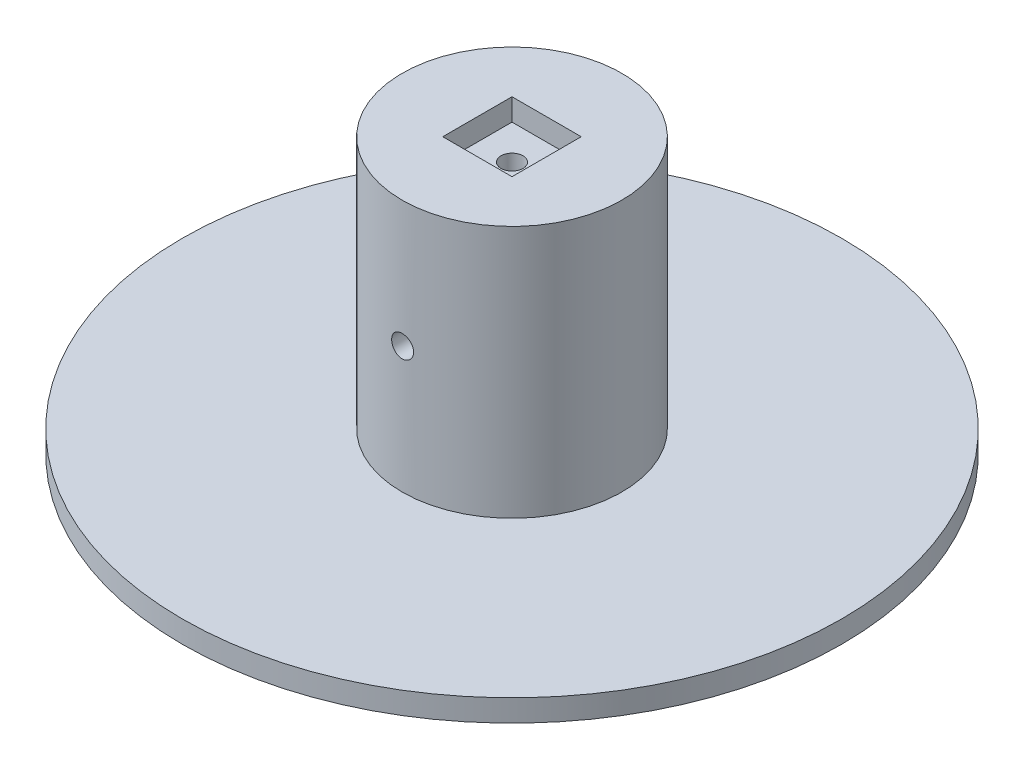
ISO-10303-21;
HEADER;
FILE_DESCRIPTION(('STEP AP214'),'2;1');
FILE_NAME('part.step','',(''),(''),'','','');
FILE_SCHEMA(('AUTOMOTIVE_DESIGN { 1 0 10303 214 1 1 1 1 }'));
ENDSEC;
DATA;
#1=APPLICATION_CONTEXT('core data for automotive mechanical design processes');
#2=APPLICATION_PROTOCOL_DEFINITION('international standard','automotive_design',2000,#1);
#3=PRODUCT_CONTEXT('',#1,'mechanical');
#4=PRODUCT('Part','Part','',(#3));
#5=PRODUCT_RELATED_PRODUCT_CATEGORY('part','',(#4));
#6=PRODUCT_DEFINITION_FORMATION('','',#4);
#7=PRODUCT_DEFINITION_CONTEXT('part definition',#1,'design');
#8=PRODUCT_DEFINITION('design','',#6,#7);
#9=PRODUCT_DEFINITION_SHAPE('','',#8);
#10=(LENGTH_UNIT() NAMED_UNIT(*) SI_UNIT(.MILLI.,.METRE.));
#11=(NAMED_UNIT(*) PLANE_ANGLE_UNIT() SI_UNIT($,.RADIAN.));
#12=(NAMED_UNIT(*) SI_UNIT($,.STERADIAN.) SOLID_ANGLE_UNIT());
#13=UNCERTAINTY_MEASURE_WITH_UNIT(LENGTH_MEASURE(1.E-05),#10,'distance_accuracy_value','');
#14=(GEOMETRIC_REPRESENTATION_CONTEXT(3) GLOBAL_UNCERTAINTY_ASSIGNED_CONTEXT((#13)) GLOBAL_UNIT_ASSIGNED_CONTEXT((#10,
#11,#12)) REPRESENTATION_CONTEXT('',''));
#15=CARTESIAN_POINT('',(0.,0.,0.));
#16=DIRECTION('',(0.,0.,1.));
#17=DIRECTION('',(1.,0.,0.));
#18=AXIS2_PLACEMENT_3D('',#15,#16,#17);
#19=CARTESIAN_POINT('',(0.,2.,0.));
#20=DIRECTION('',(0.,-1.,0.));
#21=DIRECTION('',(0.,0.,-1.));
#22=AXIS2_PLACEMENT_3D('',#19,#20,#21);
#23=CYLINDRICAL_SURFACE('',#22,30.);
#24=CARTESIAN_POINT('',(0.,2.,0.));
#25=DIRECTION('',(0.,1.,0.));
#26=DIRECTION('',(0.,0.,1.));
#27=AXIS2_PLACEMENT_3D('',#24,#25,#26);
#28=CIRCLE('',#27,30.);
#29=CARTESIAN_POINT('',(0.,2.,30.));
#30=VERTEX_POINT('',#29);
#31=EDGE_CURVE('E11',#30,#30,#28,.T.);
#32=ORIENTED_EDGE('',*,*,#31,.F.);
#33=EDGE_LOOP('',(#32));
#34=FACE_BOUND('',#33,.T.);
#35=CARTESIAN_POINT('',(0.,0.,0.));
#36=DIRECTION('',(0.,1.,0.));
#37=DIRECTION('',(0.,0.,1.));
#38=AXIS2_PLACEMENT_3D('',#35,#36,#37);
#39=CIRCLE('',#38,30.);
#40=CARTESIAN_POINT('',(0.,0.,30.));
#41=VERTEX_POINT('',#40);
#42=EDGE_CURVE('E52',#41,#41,#39,.T.);
#43=ORIENTED_EDGE('',*,*,#42,.T.);
#44=EDGE_LOOP('',(#43));
#45=FACE_BOUND('',#44,.T.);
#46=ADVANCED_FACE('F39',(#34,#45),#23,.T.);
#47=CARTESIAN_POINT('',(0.,2.,0.));
#48=DIRECTION('',(0.,1.,0.));
#49=DIRECTION('',(0.,0.,1.));
#50=AXIS2_PLACEMENT_3D('',#47,#48,#49);
#51=PLANE('',#50);
#52=CARTESIAN_POINT('',(0.,2.,0.));
#53=DIRECTION('',(0.,1.,0.));
#54=DIRECTION('',(0.,0.,1.));
#55=AXIS2_PLACEMENT_3D('',#52,#53,#54);
#56=CIRCLE('',#55,10.);
#57=CARTESIAN_POINT('',(0.,2.,10.));
#58=VERTEX_POINT('',#57);
#59=EDGE_CURVE('E128',#58,#58,#56,.F.);
#60=ORIENTED_EDGE('',*,*,#59,.T.);
#61=EDGE_LOOP('',(#60));
#62=FACE_BOUND('',#61,.T.);
#63=ORIENTED_EDGE('',*,*,#31,.T.);
#64=EDGE_LOOP('',(#63));
#65=FACE_BOUND('',#64,.T.);
#66=ADVANCED_FACE('F180',(#62,#65),#51,.T.);
#67=CARTESIAN_POINT('',(0.,0.,0.));
#68=DIRECTION('',(0.,1.,0.));
#69=DIRECTION('',(0.,0.,1.));
#70=AXIS2_PLACEMENT_3D('',#67,#68,#69);
#71=PLANE('',#70);
#72=ORIENTED_EDGE('',*,*,#42,.F.);
#73=EDGE_LOOP('',(#72));
#74=FACE_BOUND('',#73,.T.);
#75=ADVANCED_FACE('F176',(#74),#71,.F.);
#76=CARTESIAN_POINT('',(0.,25.,0.));
#77=DIRECTION('',(0.,-1.,0.));
#78=DIRECTION('',(0.,0.,-1.));
#79=AXIS2_PLACEMENT_3D('',#76,#77,#78);
#80=CYLINDRICAL_SURFACE('',#79,10.);
#81=CARTESIAN_POINT('',(0.,14.5,-10.));
#82=CARTESIAN_POINT('',(-0.0560203537915572,14.4999975740996,-9.9999993552077));
#83=CARTESIAN_POINT('',(-0.112077745167773,14.4952767311036,-9.99952425596206));
#84=CARTESIAN_POINT('',(-0.222638398496837,14.4765156297096,-9.99767467594738));
#85=CARTESIAN_POINT('',(-0.277139879168828,14.4624651039754,-9.99629920434026));
#86=CARTESIAN_POINT('',(-0.382971675453414,14.4254577594022,-9.9928041456307));
#87=CARTESIAN_POINT('',(-0.434303884614909,14.4025063194815,-9.99068500800708));
#88=CARTESIAN_POINT('',(-0.532376160960406,14.3483590920684,-9.98593957394306));
#89=CARTESIAN_POINT('',(-0.579117138779076,14.3171649439999,-9.98331337838132));
#90=CARTESIAN_POINT('',(-0.666859550674082,14.2472973023377,-9.97783744341324));
#91=CARTESIAN_POINT('',(-0.707842144834892,14.208600200598,-9.97498701573866));
#92=CARTESIAN_POINT('',(-0.782742521430984,14.124875465737,-9.96938956906262));
#93=CARTESIAN_POINT('',(-0.816659977082654,14.0798475399576,-9.96664255484917));
#94=CARTESIAN_POINT('',(-0.876533970443618,13.9846214683164,-9.96155591552784));
#95=CARTESIAN_POINT('',(-0.902473465454881,13.9344125559051,-9.95921716710905));
#96=CARTESIAN_POINT('',(-0.945546384742761,13.830324414095,-9.95522037546525));
#97=CARTESIAN_POINT('',(-0.962680026591293,13.7764452754161,-9.95356231542222));
#98=CARTESIAN_POINT('',(-0.987599041601896,13.666738199134,-9.95112084072977));
#99=CARTESIAN_POINT('',(-0.995415653003798,13.6109174231478,-9.95033450398096));
#100=CARTESIAN_POINT('',(-1.00157528513536,13.4987511366042,-9.94971643060525));
#101=CARTESIAN_POINT('',(-0.999918554870805,13.4424056398779,-9.94988466888746));
#102=CARTESIAN_POINT('',(-0.987204280252682,13.3310046903067,-9.95115406898935));
#103=CARTESIAN_POINT('',(-0.976180844124555,13.2759453006713,-9.95225184590651));
#104=CARTESIAN_POINT('',(-0.94509914415059,13.1684620367989,-9.95525134287418));
#105=CARTESIAN_POINT('',(-0.92504075825575,13.116038198175,-9.95715307378492));
#106=CARTESIAN_POINT('',(-0.876420893881512,13.0152064127011,-9.9615500945207));
#107=CARTESIAN_POINT('',(-0.847844282719984,12.9668058105107,-9.96404643908157));
#108=CARTESIAN_POINT('',(-0.783010027353233,12.8754747850881,-9.96935051732879));
#109=CARTESIAN_POINT('',(-0.746752158336511,12.8325445220182,-9.97215826012784));
#110=CARTESIAN_POINT('',(-0.667394112412075,12.753174606011,-9.97778385312989));
#111=CARTESIAN_POINT('',(-0.624264478851369,12.7167643981192,-9.98060169332997));
#112=CARTESIAN_POINT('',(-0.532489481737118,12.6516963670896,-9.98591829078518));
#113=CARTESIAN_POINT('',(-0.483844111999606,12.6230385526435,-9.98841704768256));
#114=CARTESIAN_POINT('',(-0.38239810569237,12.5742899796897,-9.99281475667096));
#115=CARTESIAN_POINT('',(-0.329596746389909,12.5542007151819,-9.99471360414769));
#116=CARTESIAN_POINT('',(-0.221347217329938,12.5231810832882,-9.99769647441408));
#117=CARTESIAN_POINT('',(-0.165899126776606,12.5122504420094,-9.99878052157063));
#118=CARTESIAN_POINT('',(-0.0541850990919098,12.4998956922652,-10.0000085166831));
#119=CARTESIAN_POINT('',(0.00207630210548582,12.4984309517475,-10.0001564826774));
#120=CARTESIAN_POINT('',(0.114043793315694,12.5049428630488,-9.99950641756797));
#121=CARTESIAN_POINT('',(0.169749890820464,12.5129193873153,-9.99870839924468));
#122=CARTESIAN_POINT('',(0.278908206834669,12.5380536954216,-9.99625861539194));
#123=CARTESIAN_POINT('',(0.332364848972014,12.555192454478,-9.99460861918039));
#124=CARTESIAN_POINT('',(0.435644321383776,12.5981451740373,-9.99063998860609));
#125=CARTESIAN_POINT('',(0.485467070157112,12.6239593290394,-9.98832133925254));
#126=CARTESIAN_POINT('',(0.580248180172137,12.6836308386639,-9.98326475330422));
#127=CARTESIAN_POINT('',(0.625189659748912,12.7175148889258,-9.98052543603441));
#128=CARTESIAN_POINT('',(0.708761623311874,12.7923260677409,-9.9749393286952));
#129=CARTESIAN_POINT('',(0.747391948849172,12.8332533730703,-9.97209253592971));
#130=CARTESIAN_POINT('',(0.817386109887141,12.921166574659,-9.96660024140755));
#131=CARTESIAN_POINT('',(0.848723278679539,12.9681737565426,-9.96395550138975));
#132=CARTESIAN_POINT('',(0.903058258743824,13.0668073601467,-9.9591783246089));
#133=CARTESIAN_POINT('',(0.926056184053878,13.1184337186884,-9.95704588084038));
#134=CARTESIAN_POINT('',(0.963015208684472,13.2247487394658,-9.95353947634049));
#135=CARTESIAN_POINT('',(0.976992174811858,13.2794318400911,-9.95216418449789));
#136=CARTESIAN_POINT('',(0.99556400712946,13.3903831979608,-9.95032365282877));
#137=CARTESIAN_POINT('',(1.00015914239951,13.4466514096957,-9.94985838690186));
#138=CARTESIAN_POINT('',(0.999833138471254,13.5589106883567,-9.94989113107562));
#139=CARTESIAN_POINT('',(0.99495388959311,13.6149018828828,-9.95038490087009));
#140=CARTESIAN_POINT('',(0.975905452963651,13.7252649171683,-9.95227103889546));
#141=CARTESIAN_POINT('',(0.961736254762158,13.779636755106,-9.95366340813718));
#142=CARTESIAN_POINT('',(0.924521686297502,13.8852173490479,-9.95718868263187));
#143=CARTESIAN_POINT('',(0.901477544340915,13.9364265416297,-9.95932148540361));
#144=CARTESIAN_POINT('',(0.847171554911044,14.034256891671,-9.96408751839359));
#145=CARTESIAN_POINT('',(0.815909753455415,14.0808780748206,-9.96672074580951));
#146=CARTESIAN_POINT('',(0.745898556285331,14.1684236744719,-9.97220487209698));
#147=CARTESIAN_POINT('',(0.707117948890268,14.2093230763671,-9.97505664726751));
#148=CARTESIAN_POINT('',(0.623231699225109,14.2840522326997,-9.98064854728783));
#149=CARTESIAN_POINT('',(0.578124544108257,14.3178802913572,-9.98338864522976));
#150=CARTESIAN_POINT('',(0.48274143416129,14.3775734538546,-9.98845562069162));
#151=CARTESIAN_POINT('',(0.432452749346764,14.4034182909452,-9.99078144026812));
#152=CARTESIAN_POINT('',(0.328258279100552,14.4462624228239,-9.99474629249896));
#153=CARTESIAN_POINT('',(0.27435664982561,14.4632716909535,-9.99638609909654));
#154=CARTESIAN_POINT('',(0.183458261405705,14.4837206170848,-9.99838213773734));
#155=CARTESIAN_POINT('',(0.147042552844509,14.4898170442994,-9.99898600691833));
#156=CARTESIAN_POINT('',(0.0737565808173131,14.4979575260618,-9.99979514950786));
#157=CARTESIAN_POINT('',(0.0368863192265579,14.5000015973219,-10.0000004245602));
#158=CARTESIAN_POINT('',(0.,14.5,-10.));
#159=B_SPLINE_CURVE_WITH_KNOTS('',3,(#81,#82,#83,#84,#85,#86,#87,#88,#89,#90,#91,#92,#93,#94,
#95,#96,#97,#98,#99,#100,#101,#102,#103,#104,#105,#106,#107,#108,#109,#110,#111,#112,#113,#114,
#115,#116,#117,#118,#119,#120,#121,#122,#123,#124,#125,#126,#127,#128,#129,#130,#131,#132,#133,
#134,#135,#136,#137,#138,#139,#140,#141,#142,#143,#144,#145,#146,#147,#148,#149,#150,#151,#152,
#153,#154,#155,#156,#157,#158),.UNSPECIFIED.,.T.,.F.,(4,2,2,2,2,2,2,2,2,2,2,2,2,2,2,2,2,2,2,2,2,
2,2,2,2,2,2,2,2,2,2,2,2,2,2,2,2,2,4),(0.,0.167926366268474,0.336037842835486,0.504047885732202,
0.672024537582781,0.840538568622943,1.00906039220706,1.17793975472222,1.34681494442504,
1.51512232045197,1.68342527255777,1.85111797441111,2.01881294161634,2.18680761372895,
2.35480720331125,2.52354734196207,2.69228766979772,2.86105740693582,3.02982209675439,
3.19786188607758,3.36589940519143,3.53358935294305,3.70128306049467,3.86953940748699,
4.0377999781023,4.20666643608599,4.37553058475374,4.54409690593003,4.71265839239586,
4.88047629293956,5.0482943822604,5.216089253628,5.3838831853896,5.55238917427654,
5.72093552636958,5.88990631026242,6.05868594795295,6.16925667232349,6.27982694069027),.UNSPECIFIED.);
#160=CARTESIAN_POINT('',(0.,14.5,-10.));
#161=VERTEX_POINT('',#160);
#162=EDGE_CURVE('E42',#161,#161,#159,.T.);
#163=ORIENTED_EDGE('',*,*,#162,.T.);
#164=EDGE_LOOP('',(#163));
#165=FACE_BOUND('',#164,.T.);
#166=CARTESIAN_POINT('',(0.999999999999998,13.5,9.9498743710662));
#167=CARTESIAN_POINT('',(0.999997573393509,13.4439804358264,9.94987502796903));
#168=CARTESIAN_POINT('',(0.995276858982473,13.3879238315882,9.95035256994218));
#169=CARTESIAN_POINT('',(0.976516314763559,13.2773648137065,9.95221087558119));
#170=CARTESIAN_POINT('',(0.962466214886433,13.2228641819625,9.95359263461219));
#171=CARTESIAN_POINT('',(0.925460116068924,13.1170341807821,9.95710133047387));
#172=CARTESIAN_POINT('',(0.902509516293896,13.0657029106086,9.9592278154679));
#173=CARTESIAN_POINT('',(0.848364267391098,12.9676322077082,9.96398580571821));
#174=CARTESIAN_POINT('',(0.817171255625923,12.9208918655163,9.96661721064329));
#175=CARTESIAN_POINT('',(0.747304761998702,12.8331487363425,9.97209926709898));
#176=CARTESIAN_POINT('',(0.708607418108258,12.7921649904962,9.97495060005266));
#177=CARTESIAN_POINT('',(0.624881715319563,12.7172623909964,9.98054505235719));
#178=CARTESIAN_POINT('',(0.579853066906567,12.6833438605937,9.98328816675213));
#179=CARTESIAN_POINT('',(0.484626361650985,12.6234687429928,9.98836383155605));
#180=CARTESIAN_POINT('',(0.434417662529568,12.5975290012063,9.99069550894647));
#181=CARTESIAN_POINT('',(0.330329984287509,12.5544555668513,9.9946781687577));
#182=CARTESIAN_POINT('',(0.276451094668217,12.5373216596305,9.99632916777064));
#183=CARTESIAN_POINT('',(0.166744782742947,12.5124020906468,9.99875966571025));
#184=CARTESIAN_POINT('',(0.110924527031579,12.5045851672501,9.99954207842817));
#185=CARTESIAN_POINT('',(-0.00124074068894524,12.4984247308663,10.0001571559869));
#186=CARTESIAN_POINT('',(-0.0575857390544635,12.5000809722537,9.99998984545273));
#187=CARTESIAN_POINT('',(-0.168988844064562,12.5127944726502,9.99872671311186));
#188=CARTESIAN_POINT('',(-0.224050829934981,12.5238181155639,9.99763421151713));
#189=CARTESIAN_POINT('',(-0.331539179504536,12.5549011289466,9.9946472926493));
#190=CARTESIAN_POINT('',(-0.383965508957731,12.5749606167876,9.99275286495953));
#191=CARTESIAN_POINT('',(-0.484800314679589,12.6235827632544,9.98836937483915));
#192=CARTESIAN_POINT('',(-0.533201570981652,12.6521602975302,9.98587927365758));
#193=CARTESIAN_POINT('',(-0.624533513174195,12.7169965233364,9.98058384519407));
#194=CARTESIAN_POINT('',(-0.667464038560829,12.7532554401452,9.97777850866811));
#195=CARTESIAN_POINT('',(-0.746832771822691,12.8326142295136,9.97215293467852));
#196=CARTESIAN_POINT('',(-0.783241746190347,12.8757433447416,9.96933268573028));
#197=CARTESIAN_POINT('',(-0.848307535357921,12.9675168652108,9.96400739928222));
#198=CARTESIAN_POINT('',(-0.876964338912893,13.0161612784521,9.96150236223964));
#199=CARTESIAN_POINT('',(-0.925712184573233,13.1176070251998,9.95709089514149));
#200=CARTESIAN_POINT('',(-0.945801420572962,13.1704092324229,9.95518459132555));
#201=CARTESIAN_POINT('',(-0.976820735637592,13.2786606046147,9.95218901870938));
#202=CARTESIAN_POINT('',(-0.987751093743036,13.3341096888874,9.95109972501768));
#203=CARTESIAN_POINT('',(-1.00010477539196,13.4458241795295,9.94986580527417));
#204=CARTESIAN_POINT('',(-1.00156899664721,13.5020850202648,9.94971711547603));
#205=CARTESIAN_POINT('',(-0.995056246871365,13.6140512658229,9.95037051354771));
#206=CARTESIAN_POINT('',(-0.987079403409757,13.6697566781404,9.95117258857061));
#207=CARTESIAN_POINT('',(-0.961945174507522,13.7789115822783,9.95363344422402));
#208=CARTESIAN_POINT('',(-0.944807127188911,13.8323655710947,9.95529042001345));
#209=CARTESIAN_POINT('',(-0.901856719675942,13.9356400517303,9.95927291038795));
#210=CARTESIAN_POINT('',(-0.87604416078359,13.9854604602872,9.9615984402867));
#211=CARTESIAN_POINT('',(-0.81637500142322,14.0802399740288,9.96666584355714));
#212=CARTESIAN_POINT('',(-0.782491299840693,14.1251819419663,9.96940910814672));
#213=CARTESIAN_POINT('',(-0.707680533451176,14.2087550532741,9.97499832625186));
#214=CARTESIAN_POINT('',(-0.666753294248137,14.2473860403401,9.97784428230866));
#215=CARTESIAN_POINT('',(-0.578839804226477,14.3173816333981,9.98333047849302));
#216=CARTESIAN_POINT('',(-0.531832255969455,14.3487195595862,9.98596994055474));
#217=CARTESIAN_POINT('',(-0.433197717417134,14.4030558685064,9.99073442106631));
#218=CARTESIAN_POINT('',(-0.381570790429628,14.4260543655071,9.99285944656492));
#219=CARTESIAN_POINT('',(-0.275256126432818,14.4630137676553,9.99635210414006));
#220=CARTESIAN_POINT('',(-0.220574037649962,14.4769907873252,9.99772108605649));
#221=CARTESIAN_POINT('',(-0.109624813983682,14.4955630695798,9.99955294613649));
#222=CARTESIAN_POINT('',(-0.05335772369222,14.500158595834,10.0000158497656));
#223=CARTESIAN_POINT('',(0.0589022240757444,14.4998337335601,9.99998338313269));
#224=CARTESIAN_POINT('',(0.114895207224526,14.4949547631633,9.99949218376669));
#225=CARTESIAN_POINT('',(0.225261888356361,14.475906254343,9.99761493577591));
#226=CARTESIAN_POINT('',(0.279635585068363,14.461736708627,9.99622888644873));
#227=CARTESIAN_POINT('',(0.385219908767741,14.4245207426071,9.99271723813962));
#228=CARTESIAN_POINT('',(0.436430966077526,14.4014755330658,9.99059174003249));
#229=CARTESIAN_POINT('',(0.534264600154793,14.347166831083,9.98583812416296));
#230=CARTESIAN_POINT('',(0.580887203768557,14.3159033867289,9.98321000934154));
#231=CARTESIAN_POINT('',(0.668432724426935,14.2458903809762,9.97773184669055));
#232=CARTESIAN_POINT('',(0.709330926219337,14.2071099837552,9.97488091460699));
#233=CARTESIAN_POINT('',(0.784057759393139,14.1232246484546,9.96928590769659));
#234=CARTESIAN_POINT('',(0.817884691847844,14.0781181948309,9.96654185867777));
#235=CARTESIAN_POINT('',(0.87757664042405,13.9827356580801,9.96146383410601));
#236=CARTESIAN_POINT('',(0.903421187994831,13.9324467186759,9.95913091925306));
#237=CARTESIAN_POINT('',(0.946264708098765,13.8282517087538,9.95515194762462));
#238=CARTESIAN_POINT('',(0.963273657889855,13.7743497960743,9.95350511653359));
#239=CARTESIAN_POINT('',(0.983721688333527,13.6834522591009,9.95150007538145));
#240=CARTESIAN_POINT('',(0.989817712398222,13.6470377486936,9.95089331935694));
#241=CARTESIAN_POINT('',(0.997957658605111,13.5737541769574,9.95008025177663));
#242=CARTESIAN_POINT('',(1.00000159775726,13.5368851175374,9.94987393853984));
#243=CARTESIAN_POINT('',(0.999999999999998,13.5,9.9498743710662));
#244=B_SPLINE_CURVE_WITH_KNOTS('',3,(#166,#167,#168,#169,#170,#171,#172,#173,#174,#175,#176,
#177,#178,#179,#180,#181,#182,#183,#184,#185,#186,#187,#188,#189,#190,#191,#192,#193,#194,#195,
#196,#197,#198,#199,#200,#201,#202,#203,#204,#205,#206,#207,#208,#209,#210,#211,#212,#213,#214,
#215,#216,#217,#218,#219,#220,#221,#222,#223,#224,#225,#226,#227,#228,#229,#230,#231,#232,#233,
#234,#235,#236,#237,#238,#239,#240,#241,#242,#243),.UNSPECIFIED.,.T.,.F.,(4,2,2,2,2,2,2,2,2,2,2,
2,2,2,2,2,2,2,2,2,2,2,2,2,2,2,2,2,2,2,2,2,2,2,2,2,2,2,4),(0.,0.167923994436462,
0.336033151821769,0.504040490997475,0.672014480421313,0.840531615299249,1.00905645855253,
1.17793469971292,1.34680882407795,1.51511470898449,1.68341622998232,1.85111631818662,
2.01881858480974,2.18681545466413,2.35481725218529,2.52355425085001,2.69229149427563,
2.86106429117934,3.02983194595033,3.19786996307765,3.3659057096687,3.53358814704527,
3.70127442561047,3.86953189811718,4.03779353723203,4.20666136818118,4.37552688518005,
4.54408992694361,4.71264823113149,4.88047133468483,5.04829456996658,5.21609491995246,
5.38389428810799,5.55239715037988,5.72094045034525,5.88991241070476,6.05869314894001,
6.16926027606046,6.27982693903815),.UNSPECIFIED.);
#245=CARTESIAN_POINT('',(0.999999999999998,13.5,9.9498743710662));
#246=VERTEX_POINT('',#245);
#247=EDGE_CURVE('E135',#246,#246,#244,.T.);
#248=ORIENTED_EDGE('',*,*,#247,.T.);
#249=EDGE_LOOP('',(#248));
#250=FACE_BOUND('',#249,.T.);
#251=ORIENTED_EDGE('',*,*,#59,.F.);
#252=EDGE_LOOP('',(#251));
#253=FACE_BOUND('',#252,.T.);
#254=CARTESIAN_POINT('',(0.,25.,0.));
#255=DIRECTION('',(0.,1.,0.));
#256=DIRECTION('',(0.,0.,1.));
#257=AXIS2_PLACEMENT_3D('',#254,#255,#256);
#258=CIRCLE('',#257,10.);
#259=CARTESIAN_POINT('',(0.,25.,10.));
#260=VERTEX_POINT('',#259);
#261=EDGE_CURVE('E123',#260,#260,#258,.T.);
#262=ORIENTED_EDGE('',*,*,#261,.F.);
#263=EDGE_LOOP('',(#262));
#264=FACE_BOUND('',#263,.T.);
#265=ADVANCED_FACE('F140',(#165,#250,#253,#264),#80,.T.);
#266=CARTESIAN_POINT('',(0.,25.,0.));
#267=DIRECTION('',(0.,1.,0.));
#268=DIRECTION('',(0.,0.,1.));
#269=AXIS2_PLACEMENT_3D('',#266,#267,#268);
#270=PLANE('',#269);
#271=DIRECTION('',(0.,0.,-1.));
#272=VECTOR('',#271,1.);
#273=CARTESIAN_POINT('',(3.15,25.,3.15));
#274=LINE('',#273,#272);
#275=CARTESIAN_POINT('',(3.15,25.,3.15));
#276=VERTEX_POINT('',#275);
#277=CARTESIAN_POINT('',(3.15,25.,-3.15));
#278=VERTEX_POINT('',#277);
#279=EDGE_CURVE('E60',#276,#278,#274,.T.);
#280=ORIENTED_EDGE('',*,*,#279,.F.);
#281=DIRECTION('',(1.,0.,0.));
#282=VECTOR('',#281,1.);
#283=CARTESIAN_POINT('',(-3.15,25.,3.15));
#284=LINE('',#283,#282);
#285=CARTESIAN_POINT('',(-3.15,25.,3.15));
#286=VERTEX_POINT('',#285);
#287=EDGE_CURVE('E111',#286,#276,#284,.T.);
#288=ORIENTED_EDGE('',*,*,#287,.F.);
#289=DIRECTION('',(0.,0.,1.));
#290=VECTOR('',#289,1.);
#291=CARTESIAN_POINT('',(-3.15,25.,3.15));
#292=LINE('',#291,#290);
#293=CARTESIAN_POINT('',(-3.15,25.,-3.15));
#294=VERTEX_POINT('',#293);
#295=EDGE_CURVE('E119',#294,#286,#292,.T.);
#296=ORIENTED_EDGE('',*,*,#295,.F.);
#297=DIRECTION('',(-1.,0.,0.));
#298=VECTOR('',#297,1.);
#299=CARTESIAN_POINT('',(-3.15,25.,-3.15));
#300=LINE('',#299,#298);
#301=EDGE_CURVE('E95',#278,#294,#300,.T.);
#302=ORIENTED_EDGE('',*,*,#301,.F.);
#303=EDGE_LOOP('',(#280,#288,#296,#302));
#304=FACE_BOUND('',#303,.T.);
#305=ORIENTED_EDGE('',*,*,#261,.T.);
#306=EDGE_LOOP('',(#305));
#307=FACE_BOUND('',#306,.T.);
#308=ADVANCED_FACE('F170',(#304,#307),#270,.T.);
#309=CARTESIAN_POINT('',(3.15,23.,3.15));
#310=DIRECTION('',(1.,0.,0.));
#311=DIRECTION('',(0.,0.,-1.));
#312=AXIS2_PLACEMENT_3D('',#309,#310,#311);
#313=PLANE('',#312);
#314=ORIENTED_EDGE('',*,*,#279,.T.);
#315=DIRECTION('',(0.,1.,0.));
#316=VECTOR('',#315,1.);
#317=CARTESIAN_POINT('',(3.15,23.,-3.15));
#318=LINE('',#317,#316);
#319=CARTESIAN_POINT('',(3.15,23.,-3.15));
#320=VERTEX_POINT('',#319);
#321=EDGE_CURVE('E83',#320,#278,#318,.T.);
#322=ORIENTED_EDGE('',*,*,#321,.F.);
#323=DIRECTION('',(0.,0.,-1.));
#324=VECTOR('',#323,1.);
#325=CARTESIAN_POINT('',(3.15,23.,3.15));
#326=LINE('',#325,#324);
#327=CARTESIAN_POINT('',(3.15,23.,3.15));
#328=VERTEX_POINT('',#327);
#329=EDGE_CURVE('E109',#328,#320,#326,.T.);
#330=ORIENTED_EDGE('',*,*,#329,.F.);
#331=DIRECTION('',(0.,1.,0.));
#332=VECTOR('',#331,1.);
#333=CARTESIAN_POINT('',(3.15,23.,3.15));
#334=LINE('',#333,#332);
#335=EDGE_CURVE('E68',#328,#276,#334,.T.);
#336=ORIENTED_EDGE('',*,*,#335,.T.);
#337=EDGE_LOOP('',(#314,#322,#330,#336));
#338=FACE_BOUND('',#337,.T.);
#339=ADVANCED_FACE('F164',(#338),#313,.F.);
#340=CARTESIAN_POINT('',(-3.15,23.,3.15));
#341=DIRECTION('',(0.,0.,1.));
#342=DIRECTION('',(1.,0.,0.));
#343=AXIS2_PLACEMENT_3D('',#340,#341,#342);
#344=PLANE('',#343);
#345=ORIENTED_EDGE('',*,*,#287,.T.);
#346=ORIENTED_EDGE('',*,*,#335,.F.);
#347=DIRECTION('',(1.,0.,0.));
#348=VECTOR('',#347,1.);
#349=CARTESIAN_POINT('',(-3.15,23.,3.15));
#350=LINE('',#349,#348);
#351=CARTESIAN_POINT('',(-3.15,23.,3.15));
#352=VERTEX_POINT('',#351);
#353=EDGE_CURVE('E106',#352,#328,#350,.T.);
#354=ORIENTED_EDGE('',*,*,#353,.F.);
#355=DIRECTION('',(0.,1.,0.));
#356=VECTOR('',#355,1.);
#357=CARTESIAN_POINT('',(-3.15,23.,3.15));
#358=LINE('',#357,#356);
#359=EDGE_CURVE('E99',#352,#286,#358,.T.);
#360=ORIENTED_EDGE('',*,*,#359,.T.);
#361=EDGE_LOOP('',(#345,#346,#354,#360));
#362=FACE_BOUND('',#361,.T.);
#363=ADVANCED_FACE('F161',(#362),#344,.F.);
#364=CARTESIAN_POINT('',(-3.15,23.,3.15));
#365=DIRECTION('',(-1.,0.,0.));
#366=DIRECTION('',(0.,0.,1.));
#367=AXIS2_PLACEMENT_3D('',#364,#365,#366);
#368=PLANE('',#367);
#369=ORIENTED_EDGE('',*,*,#295,.T.);
#370=ORIENTED_EDGE('',*,*,#359,.F.);
#371=DIRECTION('',(0.,0.,1.));
#372=VECTOR('',#371,1.);
#373=CARTESIAN_POINT('',(-3.15,23.,3.15));
#374=LINE('',#373,#372);
#375=CARTESIAN_POINT('',(-3.15,23.,-3.15));
#376=VERTEX_POINT('',#375);
#377=EDGE_CURVE('E102',#376,#352,#374,.T.);
#378=ORIENTED_EDGE('',*,*,#377,.F.);
#379=DIRECTION('',(0.,1.,0.));
#380=VECTOR('',#379,1.);
#381=CARTESIAN_POINT('',(-3.15,23.,-3.15));
#382=LINE('',#381,#380);
#383=EDGE_CURVE('E88',#376,#294,#382,.T.);
#384=ORIENTED_EDGE('',*,*,#383,.T.);
#385=EDGE_LOOP('',(#369,#370,#378,#384));
#386=FACE_BOUND('',#385,.T.);
#387=ADVANCED_FACE('F103',(#386),#368,.F.);
#388=CARTESIAN_POINT('',(-3.15,23.,-3.15));
#389=DIRECTION('',(0.,0.,-1.));
#390=DIRECTION('',(-1.,0.,0.));
#391=AXIS2_PLACEMENT_3D('',#388,#389,#390);
#392=PLANE('',#391);
#393=ORIENTED_EDGE('',*,*,#301,.T.);
#394=ORIENTED_EDGE('',*,*,#383,.F.);
#395=DIRECTION('',(-1.,0.,0.));
#396=VECTOR('',#395,1.);
#397=CARTESIAN_POINT('',(-3.15,23.,-3.15));
#398=LINE('',#397,#396);
#399=EDGE_CURVE('E92',#320,#376,#398,.T.);
#400=ORIENTED_EDGE('',*,*,#399,.F.);
#401=ORIENTED_EDGE('',*,*,#321,.T.);
#402=EDGE_LOOP('',(#393,#394,#400,#401));
#403=FACE_BOUND('',#402,.T.);
#404=ADVANCED_FACE('F90',(#403),#392,.F.);
#405=CARTESIAN_POINT('',(0.,23.,0.));
#406=DIRECTION('',(0.,-1.,0.));
#407=DIRECTION('',(0.,0.,-1.));
#408=AXIS2_PLACEMENT_3D('',#405,#406,#407);
#409=PLANE('',#408);
#410=CARTESIAN_POINT('',(0.,23.,0.));
#411=DIRECTION('',(0.,-1.,0.));
#412=DIRECTION('',(0.,0.,-1.));
#413=AXIS2_PLACEMENT_3D('',#410,#411,#412);
#414=CIRCLE('',#413,1.);
#415=CARTESIAN_POINT('',(0.,23.,-1.));
#416=VERTEX_POINT('',#415);
#417=EDGE_CURVE('E117',#416,#416,#414,.T.);
#418=ORIENTED_EDGE('',*,*,#417,.T.);
#419=EDGE_LOOP('',(#418));
#420=FACE_BOUND('',#419,.T.);
#421=ORIENTED_EDGE('',*,*,#329,.T.);
#422=ORIENTED_EDGE('',*,*,#399,.T.);
#423=ORIENTED_EDGE('',*,*,#377,.T.);
#424=ORIENTED_EDGE('',*,*,#353,.T.);
#425=EDGE_LOOP('',(#421,#422,#423,#424));
#426=FACE_BOUND('',#425,.T.);
#427=ADVANCED_FACE('F108',(#420,#426),#409,.F.);
#428=CARTESIAN_POINT('',(0.,21.,0.));
#429=DIRECTION('',(0.,1.,0.));
#430=DIRECTION('',(0.,0.,1.));
#431=AXIS2_PLACEMENT_3D('',#428,#429,#430);
#432=CYLINDRICAL_SURFACE('',#431,1.);
#433=CARTESIAN_POINT('',(0.,21.,0.));
#434=DIRECTION('',(0.,1.,0.));
#435=DIRECTION('',(0.,0.,1.));
#436=AXIS2_PLACEMENT_3D('',#433,#434,#435);
#437=CIRCLE('',#436,1.);
#438=CARTESIAN_POINT('',(0.,21.,1.));
#439=VERTEX_POINT('',#438);
#440=EDGE_CURVE('E134',#439,#439,#437,.T.);
#441=ORIENTED_EDGE('',*,*,#440,.F.);
#442=EDGE_LOOP('',(#441));
#443=FACE_BOUND('',#442,.T.);
#444=ORIENTED_EDGE('',*,*,#417,.F.);
#445=EDGE_LOOP('',(#444));
#446=FACE_BOUND('',#445,.T.);
#447=ADVANCED_FACE('F153',(#443,#446),#432,.F.);
#448=CARTESIAN_POINT('',(0.,21.,0.));
#449=DIRECTION('',(0.,1.,0.));
#450=DIRECTION('',(0.,0.,1.));
#451=AXIS2_PLACEMENT_3D('',#448,#449,#450);
#452=PLANE('',#451);
#453=ORIENTED_EDGE('',*,*,#440,.T.);
#454=EDGE_LOOP('',(#453));
#455=FACE_BOUND('',#454,.T.);
#456=ADVANCED_FACE('F148',(#455),#452,.T.);
#457=CARTESIAN_POINT('',(0.,13.5,-30.));
#458=DIRECTION('',(0.,0.,1.));
#459=DIRECTION('',(1.,0.,0.));
#460=AXIS2_PLACEMENT_3D('',#457,#458,#459);
#461=CYLINDRICAL_SURFACE('',#460,1.);
#462=ORIENTED_EDGE('',*,*,#247,.F.);
#463=EDGE_LOOP('',(#462));
#464=FACE_BOUND('',#463,.T.);
#465=ORIENTED_EDGE('',*,*,#162,.F.);
#466=EDGE_LOOP('',(#465));
#467=FACE_BOUND('',#466,.T.);
#468=ADVANCED_FACE('F144',(#464,#467),#461,.F.);
#469=CLOSED_SHELL('',(#46,#66,#75,#265,#308,#339,#363,#387,#404,#427,#447,#456,#468));
#470=MANIFOLD_SOLID_BREP('B2',#469);
#471=ADVANCED_BREP_SHAPE_REPRESENTATION('',(#18,#470),#14);
#472=SHAPE_DEFINITION_REPRESENTATION(#9,#471);
ENDSEC;
END-ISO-10303-21;
